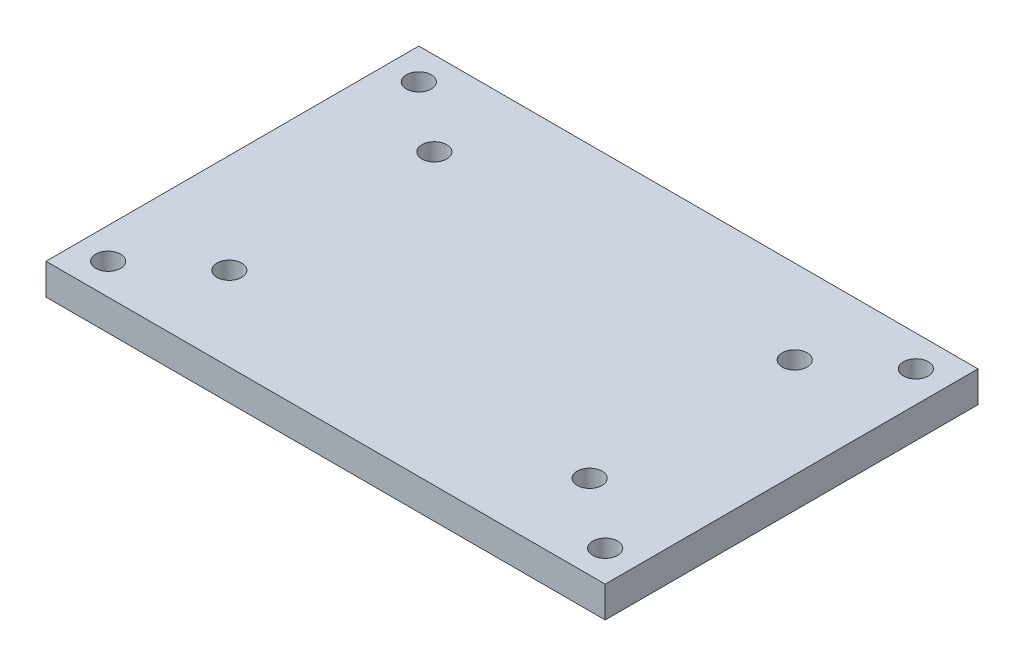
ISO-10303-21;
HEADER;
FILE_DESCRIPTION(('STEP AP214'),'2;1');
FILE_NAME('part.step','',(''),(''),'','','');
FILE_SCHEMA(('AUTOMOTIVE_DESIGN { 1 0 10303 214 1 1 1 1 }'));
ENDSEC;
DATA;
#1=APPLICATION_CONTEXT('core data for automotive mechanical design processes');
#2=APPLICATION_PROTOCOL_DEFINITION('international standard','automotive_design',2000,#1);
#3=PRODUCT_CONTEXT('',#1,'mechanical');
#4=PRODUCT('Part','Part','',(#3));
#5=PRODUCT_RELATED_PRODUCT_CATEGORY('part','',(#4));
#6=PRODUCT_DEFINITION_FORMATION('','',#4);
#7=PRODUCT_DEFINITION_CONTEXT('part definition',#1,'design');
#8=PRODUCT_DEFINITION('design','',#6,#7);
#9=PRODUCT_DEFINITION_SHAPE('','',#8);
#10=(LENGTH_UNIT() NAMED_UNIT(*) SI_UNIT(.MILLI.,.METRE.));
#11=(NAMED_UNIT(*) PLANE_ANGLE_UNIT() SI_UNIT($,.RADIAN.));
#12=(NAMED_UNIT(*) SI_UNIT($,.STERADIAN.) SOLID_ANGLE_UNIT());
#13=UNCERTAINTY_MEASURE_WITH_UNIT(LENGTH_MEASURE(1.E-05),#10,'distance_accuracy_value','');
#14=(GEOMETRIC_REPRESENTATION_CONTEXT(3) GLOBAL_UNCERTAINTY_ASSIGNED_CONTEXT((#13)) GLOBAL_UNIT_ASSIGNED_CONTEXT((#10,
#11,#12)) REPRESENTATION_CONTEXT('',''));
#15=CARTESIAN_POINT('',(0.,0.,0.));
#16=DIRECTION('',(0.,0.,1.));
#17=DIRECTION('',(1.,0.,0.));
#18=AXIS2_PLACEMENT_3D('',#15,#16,#17);
#19=CARTESIAN_POINT('',(0.,5.,0.));
#20=DIRECTION('',(0.,1.,0.));
#21=DIRECTION('',(0.,0.,1.));
#22=AXIS2_PLACEMENT_3D('',#19,#20,#21);
#23=PLANE('',#22);
#24=CARTESIAN_POINT('',(29.,5.,16.5));
#25=DIRECTION('',(0.,1.,0.));
#26=DIRECTION('',(0.,0.,1.));
#27=AXIS2_PLACEMENT_3D('',#24,#25,#26);
#28=CIRCLE('',#27,2.);
#29=CARTESIAN_POINT('',(29.,5.,18.5));
#30=VERTEX_POINT('',#29);
#31=EDGE_CURVE('E146',#30,#30,#28,.T.);
#32=ORIENTED_EDGE('',*,*,#31,.F.);
#33=EDGE_LOOP('',(#32));
#34=FACE_BOUND('',#33,.T.);
#35=CARTESIAN_POINT('',(-29.,5.,-16.5));
#36=DIRECTION('',(0.,1.,0.));
#37=DIRECTION('',(0.,0.,1.));
#38=AXIS2_PLACEMENT_3D('',#35,#36,#37);
#39=CIRCLE('',#38,2.);
#40=CARTESIAN_POINT('',(-29.,5.,-14.5));
#41=VERTEX_POINT('',#40);
#42=EDGE_CURVE('E134',#41,#41,#39,.T.);
#43=ORIENTED_EDGE('',*,*,#42,.F.);
#44=EDGE_LOOP('',(#43));
#45=FACE_BOUND('',#44,.T.);
#46=CARTESIAN_POINT('',(40.,5.,25.));
#47=DIRECTION('',(0.,1.,0.));
#48=DIRECTION('',(0.,0.,-1.));
#49=AXIS2_PLACEMENT_3D('',#46,#47,#48);
#50=CIRCLE('',#49,2.);
#51=CARTESIAN_POINT('',(40.,5.,23.));
#52=VERTEX_POINT('',#51);
#53=EDGE_CURVE('E122',#52,#52,#50,.T.);
#54=ORIENTED_EDGE('',*,*,#53,.F.);
#55=EDGE_LOOP('',(#54));
#56=FACE_BOUND('',#55,.T.);
#57=CARTESIAN_POINT('',(-40.,5.,-25.));
#58=DIRECTION('',(0.,1.,0.));
#59=DIRECTION('',(0.,0.,1.));
#60=AXIS2_PLACEMENT_3D('',#57,#58,#59);
#61=CIRCLE('',#60,2.);
#62=CARTESIAN_POINT('',(-40.,5.,-23.));
#63=VERTEX_POINT('',#62);
#64=EDGE_CURVE('E101',#63,#63,#61,.T.);
#65=ORIENTED_EDGE('',*,*,#64,.F.);
#66=EDGE_LOOP('',(#65));
#67=FACE_BOUND('',#66,.T.);
#68=DIRECTION('',(0.,0.,1.));
#69=VECTOR('',#68,1.);
#70=CARTESIAN_POINT('',(-45.,5.,30.));
#71=LINE('',#70,#69);
#72=CARTESIAN_POINT('',(-45.,5.,-30.));
#73=VERTEX_POINT('',#72);
#74=CARTESIAN_POINT('',(-45.,5.,30.));
#75=VERTEX_POINT('',#74);
#76=EDGE_CURVE('E86',#73,#75,#71,.T.);
#77=ORIENTED_EDGE('',*,*,#76,.T.);
#78=DIRECTION('',(1.,0.,0.));
#79=VECTOR('',#78,1.);
#80=CARTESIAN_POINT('',(45.,5.,30.));
#81=LINE('',#80,#79);
#82=CARTESIAN_POINT('',(45.,5.,30.));
#83=VERTEX_POINT('',#82);
#84=EDGE_CURVE('E81',#75,#83,#81,.T.);
#85=ORIENTED_EDGE('',*,*,#84,.T.);
#86=DIRECTION('',(0.,0.,-1.));
#87=VECTOR('',#86,1.);
#88=CARTESIAN_POINT('',(45.,5.,30.));
#89=LINE('',#88,#87);
#90=CARTESIAN_POINT('',(45.,5.,-30.));
#91=VERTEX_POINT('',#90);
#92=EDGE_CURVE('E84',#83,#91,#89,.T.);
#93=ORIENTED_EDGE('',*,*,#92,.T.);
#94=DIRECTION('',(-1.,0.,0.));
#95=VECTOR('',#94,1.);
#96=CARTESIAN_POINT('',(45.,5.,-30.));
#97=LINE('',#96,#95);
#98=EDGE_CURVE('E51',#91,#73,#97,.T.);
#99=ORIENTED_EDGE('',*,*,#98,.T.);
#100=EDGE_LOOP('',(#77,#85,#93,#99));
#101=FACE_BOUND('',#100,.T.);
#102=CARTESIAN_POINT('',(40.,5.,-25.));
#103=DIRECTION('',(0.,1.,0.));
#104=DIRECTION('',(0.,0.,1.));
#105=AXIS2_PLACEMENT_3D('',#102,#103,#104);
#106=CIRCLE('',#105,2.);
#107=CARTESIAN_POINT('',(40.,5.,-23.));
#108=VERTEX_POINT('',#107);
#109=EDGE_CURVE('E116',#108,#108,#106,.T.);
#110=ORIENTED_EDGE('',*,*,#109,.F.);
#111=EDGE_LOOP('',(#110));
#112=FACE_BOUND('',#111,.T.);
#113=CARTESIAN_POINT('',(-40.,5.,25.));
#114=DIRECTION('',(0.,1.,0.));
#115=DIRECTION('',(0.,0.,-1.));
#116=AXIS2_PLACEMENT_3D('',#113,#114,#115);
#117=CIRCLE('',#116,2.);
#118=CARTESIAN_POINT('',(-40.,5.,23.));
#119=VERTEX_POINT('',#118);
#120=EDGE_CURVE('E128',#119,#119,#117,.T.);
#121=ORIENTED_EDGE('',*,*,#120,.F.);
#122=EDGE_LOOP('',(#121));
#123=FACE_BOUND('',#122,.T.);
#124=CARTESIAN_POINT('',(29.,5.,-16.5));
#125=DIRECTION('',(0.,1.,0.));
#126=DIRECTION('',(0.,0.,-1.));
#127=AXIS2_PLACEMENT_3D('',#124,#125,#126);
#128=CIRCLE('',#127,2.);
#129=CARTESIAN_POINT('',(29.,5.,-18.5));
#130=VERTEX_POINT('',#129);
#131=EDGE_CURVE('E140',#130,#130,#128,.T.);
#132=ORIENTED_EDGE('',*,*,#131,.F.);
#133=EDGE_LOOP('',(#132));
#134=FACE_BOUND('',#133,.T.);
#135=CARTESIAN_POINT('',(-29.,5.,16.5));
#136=DIRECTION('',(0.,1.,0.));
#137=DIRECTION('',(0.,0.,-1.));
#138=AXIS2_PLACEMENT_3D('',#135,#136,#137);
#139=CIRCLE('',#138,2.);
#140=CARTESIAN_POINT('',(-29.,5.,14.5));
#141=VERTEX_POINT('',#140);
#142=EDGE_CURVE('E152',#141,#141,#139,.T.);
#143=ORIENTED_EDGE('',*,*,#142,.F.);
#144=EDGE_LOOP('',(#143));
#145=FACE_BOUND('',#144,.T.);
#146=ADVANCED_FACE('F34',(#34,#45,#56,#67,#101,#112,#123,#134,#145),#23,.T.);
#147=CARTESIAN_POINT('',(0.,0.,0.));
#148=DIRECTION('',(0.,1.,0.));
#149=DIRECTION('',(0.,0.,1.));
#150=AXIS2_PLACEMENT_3D('',#147,#148,#149);
#151=PLANE('',#150);
#152=DIRECTION('',(0.,0.,1.));
#153=VECTOR('',#152,1.);
#154=CARTESIAN_POINT('',(-45.,0.,30.));
#155=LINE('',#154,#153);
#156=CARTESIAN_POINT('',(-45.,0.,-30.));
#157=VERTEX_POINT('',#156);
#158=CARTESIAN_POINT('',(-45.,0.,30.));
#159=VERTEX_POINT('',#158);
#160=EDGE_CURVE('E98',#157,#159,#155,.T.);
#161=ORIENTED_EDGE('',*,*,#160,.F.);
#162=DIRECTION('',(-1.,0.,0.));
#163=VECTOR('',#162,1.);
#164=CARTESIAN_POINT('',(45.,0.,-30.));
#165=LINE('',#164,#163);
#166=CARTESIAN_POINT('',(45.,0.,-30.));
#167=VERTEX_POINT('',#166);
#168=EDGE_CURVE('E74',#167,#157,#165,.T.);
#169=ORIENTED_EDGE('',*,*,#168,.F.);
#170=DIRECTION('',(0.,0.,-1.));
#171=VECTOR('',#170,1.);
#172=CARTESIAN_POINT('',(45.,0.,30.));
#173=LINE('',#172,#171);
#174=CARTESIAN_POINT('',(45.,0.,30.));
#175=VERTEX_POINT('',#174);
#176=EDGE_CURVE('E68',#175,#167,#173,.T.);
#177=ORIENTED_EDGE('',*,*,#176,.F.);
#178=DIRECTION('',(1.,0.,0.));
#179=VECTOR('',#178,1.);
#180=CARTESIAN_POINT('',(45.,0.,30.));
#181=LINE('',#180,#179);
#182=EDGE_CURVE('E90',#159,#175,#181,.T.);
#183=ORIENTED_EDGE('',*,*,#182,.F.);
#184=EDGE_LOOP('',(#161,#169,#177,#183));
#185=FACE_BOUND('',#184,.T.);
#186=CARTESIAN_POINT('',(-40.,0.,-25.));
#187=DIRECTION('',(0.,1.,0.));
#188=DIRECTION('',(0.,0.,1.));
#189=AXIS2_PLACEMENT_3D('',#186,#187,#188);
#190=CIRCLE('',#189,2.);
#191=CARTESIAN_POINT('',(-40.,0.,-23.));
#192=VERTEX_POINT('',#191);
#193=EDGE_CURVE('E113',#192,#192,#190,.T.);
#194=ORIENTED_EDGE('',*,*,#193,.T.);
#195=EDGE_LOOP('',(#194));
#196=FACE_BOUND('',#195,.T.);
#197=CARTESIAN_POINT('',(40.,0.,-25.));
#198=DIRECTION('',(0.,1.,0.));
#199=DIRECTION('',(0.,0.,1.));
#200=AXIS2_PLACEMENT_3D('',#197,#198,#199);
#201=CIRCLE('',#200,2.);
#202=CARTESIAN_POINT('',(40.,0.,-23.));
#203=VERTEX_POINT('',#202);
#204=EDGE_CURVE('E119',#203,#203,#201,.T.);
#205=ORIENTED_EDGE('',*,*,#204,.T.);
#206=EDGE_LOOP('',(#205));
#207=FACE_BOUND('',#206,.T.);
#208=CARTESIAN_POINT('',(40.,0.,25.));
#209=DIRECTION('',(0.,1.,0.));
#210=DIRECTION('',(0.,0.,-1.));
#211=AXIS2_PLACEMENT_3D('',#208,#209,#210);
#212=CIRCLE('',#211,2.);
#213=CARTESIAN_POINT('',(40.,0.,23.));
#214=VERTEX_POINT('',#213);
#215=EDGE_CURVE('E125',#214,#214,#212,.T.);
#216=ORIENTED_EDGE('',*,*,#215,.T.);
#217=EDGE_LOOP('',(#216));
#218=FACE_BOUND('',#217,.T.);
#219=CARTESIAN_POINT('',(-40.,0.,25.));
#220=DIRECTION('',(0.,1.,0.));
#221=DIRECTION('',(0.,0.,-1.));
#222=AXIS2_PLACEMENT_3D('',#219,#220,#221);
#223=CIRCLE('',#222,2.);
#224=CARTESIAN_POINT('',(-40.,0.,23.));
#225=VERTEX_POINT('',#224);
#226=EDGE_CURVE('E131',#225,#225,#223,.T.);
#227=ORIENTED_EDGE('',*,*,#226,.T.);
#228=EDGE_LOOP('',(#227));
#229=FACE_BOUND('',#228,.T.);
#230=CARTESIAN_POINT('',(-29.,0.,-16.5));
#231=DIRECTION('',(0.,1.,0.));
#232=DIRECTION('',(0.,0.,1.));
#233=AXIS2_PLACEMENT_3D('',#230,#231,#232);
#234=CIRCLE('',#233,2.);
#235=CARTESIAN_POINT('',(-29.,0.,-14.5));
#236=VERTEX_POINT('',#235);
#237=EDGE_CURVE('E137',#236,#236,#234,.T.);
#238=ORIENTED_EDGE('',*,*,#237,.T.);
#239=EDGE_LOOP('',(#238));
#240=FACE_BOUND('',#239,.T.);
#241=CARTESIAN_POINT('',(29.,0.,-16.5));
#242=DIRECTION('',(0.,1.,0.));
#243=DIRECTION('',(0.,0.,-1.));
#244=AXIS2_PLACEMENT_3D('',#241,#242,#243);
#245=CIRCLE('',#244,2.);
#246=CARTESIAN_POINT('',(29.,0.,-18.5));
#247=VERTEX_POINT('',#246);
#248=EDGE_CURVE('E143',#247,#247,#245,.T.);
#249=ORIENTED_EDGE('',*,*,#248,.T.);
#250=EDGE_LOOP('',(#249));
#251=FACE_BOUND('',#250,.T.);
#252=CARTESIAN_POINT('',(29.,0.,16.5));
#253=DIRECTION('',(0.,1.,0.));
#254=DIRECTION('',(0.,0.,1.));
#255=AXIS2_PLACEMENT_3D('',#252,#253,#254);
#256=CIRCLE('',#255,2.);
#257=CARTESIAN_POINT('',(29.,0.,18.5));
#258=VERTEX_POINT('',#257);
#259=EDGE_CURVE('E149',#258,#258,#256,.T.);
#260=ORIENTED_EDGE('',*,*,#259,.T.);
#261=EDGE_LOOP('',(#260));
#262=FACE_BOUND('',#261,.T.);
#263=CARTESIAN_POINT('',(-29.,0.,16.5));
#264=DIRECTION('',(0.,1.,0.));
#265=DIRECTION('',(0.,0.,-1.));
#266=AXIS2_PLACEMENT_3D('',#263,#264,#265);
#267=CIRCLE('',#266,2.);
#268=CARTESIAN_POINT('',(-29.,0.,14.5));
#269=VERTEX_POINT('',#268);
#270=EDGE_CURVE('E155',#269,#269,#267,.T.);
#271=ORIENTED_EDGE('',*,*,#270,.T.);
#272=EDGE_LOOP('',(#271));
#273=FACE_BOUND('',#272,.T.);
#274=ADVANCED_FACE('F109',(#185,#196,#207,#218,#229,#240,#251,#262,#273),#151,.F.);
#275=CARTESIAN_POINT('',(-45.,5.,30.));
#276=DIRECTION('',(1.,0.,0.));
#277=DIRECTION('',(0.,0.,-1.));
#278=AXIS2_PLACEMENT_3D('',#275,#276,#277);
#279=PLANE('',#278);
#280=ORIENTED_EDGE('',*,*,#160,.T.);
#281=DIRECTION('',(0.,-1.,0.));
#282=VECTOR('',#281,1.);
#283=CARTESIAN_POINT('',(-45.,5.,30.));
#284=LINE('',#283,#282);
#285=EDGE_CURVE('E11',#75,#159,#284,.T.);
#286=ORIENTED_EDGE('',*,*,#285,.F.);
#287=ORIENTED_EDGE('',*,*,#76,.F.);
#288=DIRECTION('',(0.,-1.,0.));
#289=VECTOR('',#288,1.);
#290=CARTESIAN_POINT('',(-45.,5.,-30.));
#291=LINE('',#290,#289);
#292=EDGE_CURVE('E94',#73,#157,#291,.T.);
#293=ORIENTED_EDGE('',*,*,#292,.T.);
#294=EDGE_LOOP('',(#280,#286,#287,#293));
#295=FACE_BOUND('',#294,.T.);
#296=ADVANCED_FACE('F36',(#295),#279,.F.);
#297=CARTESIAN_POINT('',(45.,5.,30.));
#298=DIRECTION('',(0.,0.,-1.));
#299=DIRECTION('',(-1.,0.,0.));
#300=AXIS2_PLACEMENT_3D('',#297,#298,#299);
#301=PLANE('',#300);
#302=ORIENTED_EDGE('',*,*,#182,.T.);
#303=DIRECTION('',(0.,-1.,0.));
#304=VECTOR('',#303,1.);
#305=CARTESIAN_POINT('',(45.,5.,30.));
#306=LINE('',#305,#304);
#307=EDGE_CURVE('E43',#83,#175,#306,.T.);
#308=ORIENTED_EDGE('',*,*,#307,.F.);
#309=ORIENTED_EDGE('',*,*,#84,.F.);
#310=ORIENTED_EDGE('',*,*,#285,.T.);
#311=EDGE_LOOP('',(#302,#308,#309,#310));
#312=FACE_BOUND('',#311,.T.);
#313=ADVANCED_FACE('F89',(#312),#301,.F.);
#314=CARTESIAN_POINT('',(45.,5.,30.));
#315=DIRECTION('',(-1.,0.,0.));
#316=DIRECTION('',(0.,0.,1.));
#317=AXIS2_PLACEMENT_3D('',#314,#315,#316);
#318=PLANE('',#317);
#319=ORIENTED_EDGE('',*,*,#176,.T.);
#320=DIRECTION('',(0.,-1.,0.));
#321=VECTOR('',#320,1.);
#322=CARTESIAN_POINT('',(45.,5.,-30.));
#323=LINE('',#322,#321);
#324=EDGE_CURVE('E91',#91,#167,#323,.T.);
#325=ORIENTED_EDGE('',*,*,#324,.F.);
#326=ORIENTED_EDGE('',*,*,#92,.F.);
#327=ORIENTED_EDGE('',*,*,#307,.T.);
#328=EDGE_LOOP('',(#319,#325,#326,#327));
#329=FACE_BOUND('',#328,.T.);
#330=ADVANCED_FACE('F92',(#329),#318,.F.);
#331=CARTESIAN_POINT('',(45.,5.,-30.));
#332=DIRECTION('',(0.,0.,1.));
#333=DIRECTION('',(1.,0.,0.));
#334=AXIS2_PLACEMENT_3D('',#331,#332,#333);
#335=PLANE('',#334);
#336=ORIENTED_EDGE('',*,*,#168,.T.);
#337=ORIENTED_EDGE('',*,*,#292,.F.);
#338=ORIENTED_EDGE('',*,*,#98,.F.);
#339=ORIENTED_EDGE('',*,*,#324,.T.);
#340=EDGE_LOOP('',(#336,#337,#338,#339));
#341=FACE_BOUND('',#340,.T.);
#342=ADVANCED_FACE('F106',(#341),#335,.F.);
#343=CARTESIAN_POINT('',(-40.,5.,-25.));
#344=DIRECTION('',(0.,-1.,0.));
#345=DIRECTION('',(0.,0.,-1.));
#346=AXIS2_PLACEMENT_3D('',#343,#344,#345);
#347=CYLINDRICAL_SURFACE('',#346,2.);
#348=ORIENTED_EDGE('',*,*,#64,.T.);
#349=EDGE_LOOP('',(#348));
#350=FACE_BOUND('',#349,.T.);
#351=ORIENTED_EDGE('',*,*,#193,.F.);
#352=EDGE_LOOP('',(#351));
#353=FACE_BOUND('',#352,.T.);
#354=ADVANCED_FACE('F174',(#350,#353),#347,.F.);
#355=CARTESIAN_POINT('',(40.,5.,-25.));
#356=DIRECTION('',(0.,-1.,0.));
#357=DIRECTION('',(0.,0.,-1.));
#358=AXIS2_PLACEMENT_3D('',#355,#356,#357);
#359=CYLINDRICAL_SURFACE('',#358,2.);
#360=ORIENTED_EDGE('',*,*,#109,.T.);
#361=EDGE_LOOP('',(#360));
#362=FACE_BOUND('',#361,.T.);
#363=ORIENTED_EDGE('',*,*,#204,.F.);
#364=EDGE_LOOP('',(#363));
#365=FACE_BOUND('',#364,.T.);
#366=ADVANCED_FACE('F220',(#362,#365),#359,.F.);
#367=CARTESIAN_POINT('',(40.,5.,25.));
#368=DIRECTION('',(0.,-1.,0.));
#369=DIRECTION('',(0.,0.,-1.));
#370=AXIS2_PLACEMENT_3D('',#367,#368,#369);
#371=CYLINDRICAL_SURFACE('',#370,2.);
#372=ORIENTED_EDGE('',*,*,#53,.T.);
#373=EDGE_LOOP('',(#372));
#374=FACE_BOUND('',#373,.T.);
#375=ORIENTED_EDGE('',*,*,#215,.F.);
#376=EDGE_LOOP('',(#375));
#377=FACE_BOUND('',#376,.T.);
#378=ADVANCED_FACE('F228',(#374,#377),#371,.F.);
#379=CARTESIAN_POINT('',(-40.,5.,25.));
#380=DIRECTION('',(0.,-1.,0.));
#381=DIRECTION('',(0.,0.,-1.));
#382=AXIS2_PLACEMENT_3D('',#379,#380,#381);
#383=CYLINDRICAL_SURFACE('',#382,2.);
#384=ORIENTED_EDGE('',*,*,#120,.T.);
#385=EDGE_LOOP('',(#384));
#386=FACE_BOUND('',#385,.T.);
#387=ORIENTED_EDGE('',*,*,#226,.F.);
#388=EDGE_LOOP('',(#387));
#389=FACE_BOUND('',#388,.T.);
#390=ADVANCED_FACE('F236',(#386,#389),#383,.F.);
#391=CARTESIAN_POINT('',(-29.,5.,-16.5));
#392=DIRECTION('',(0.,-1.,0.));
#393=DIRECTION('',(0.,0.,-1.));
#394=AXIS2_PLACEMENT_3D('',#391,#392,#393);
#395=CYLINDRICAL_SURFACE('',#394,2.);
#396=ORIENTED_EDGE('',*,*,#42,.T.);
#397=EDGE_LOOP('',(#396));
#398=FACE_BOUND('',#397,.T.);
#399=ORIENTED_EDGE('',*,*,#237,.F.);
#400=EDGE_LOOP('',(#399));
#401=FACE_BOUND('',#400,.T.);
#402=ADVANCED_FACE('F245',(#398,#401),#395,.F.);
#403=CARTESIAN_POINT('',(29.,5.,-16.5));
#404=DIRECTION('',(0.,-1.,0.));
#405=DIRECTION('',(0.,0.,-1.));
#406=AXIS2_PLACEMENT_3D('',#403,#404,#405);
#407=CYLINDRICAL_SURFACE('',#406,2.);
#408=ORIENTED_EDGE('',*,*,#131,.T.);
#409=EDGE_LOOP('',(#408));
#410=FACE_BOUND('',#409,.T.);
#411=ORIENTED_EDGE('',*,*,#248,.F.);
#412=EDGE_LOOP('',(#411));
#413=FACE_BOUND('',#412,.T.);
#414=ADVANCED_FACE('F254',(#410,#413),#407,.F.);
#415=CARTESIAN_POINT('',(29.,5.,16.5));
#416=DIRECTION('',(0.,-1.,0.));
#417=DIRECTION('',(0.,0.,-1.));
#418=AXIS2_PLACEMENT_3D('',#415,#416,#417);
#419=CYLINDRICAL_SURFACE('',#418,2.);
#420=ORIENTED_EDGE('',*,*,#31,.T.);
#421=EDGE_LOOP('',(#420));
#422=FACE_BOUND('',#421,.T.);
#423=ORIENTED_EDGE('',*,*,#259,.F.);
#424=EDGE_LOOP('',(#423));
#425=FACE_BOUND('',#424,.T.);
#426=ADVANCED_FACE('F263',(#422,#425),#419,.F.);
#427=CARTESIAN_POINT('',(-29.,5.,16.5));
#428=DIRECTION('',(0.,-1.,0.));
#429=DIRECTION('',(0.,0.,-1.));
#430=AXIS2_PLACEMENT_3D('',#427,#428,#429);
#431=CYLINDRICAL_SURFACE('',#430,2.);
#432=ORIENTED_EDGE('',*,*,#142,.T.);
#433=EDGE_LOOP('',(#432));
#434=FACE_BOUND('',#433,.T.);
#435=ORIENTED_EDGE('',*,*,#270,.F.);
#436=EDGE_LOOP('',(#435));
#437=FACE_BOUND('',#436,.T.);
#438=ADVANCED_FACE('F161',(#434,#437),#431,.F.);
#439=CLOSED_SHELL('',(#146,#274,#296,#313,#330,#342,#354,#366,#378,#390,#402,#414,#426,#438));
#440=MANIFOLD_SOLID_BREP('B2',#439);
#441=ADVANCED_BREP_SHAPE_REPRESENTATION('',(#18,#440),#14);
#442=SHAPE_DEFINITION_REPRESENTATION(#9,#441);
ENDSEC;
END-ISO-10303-21;
